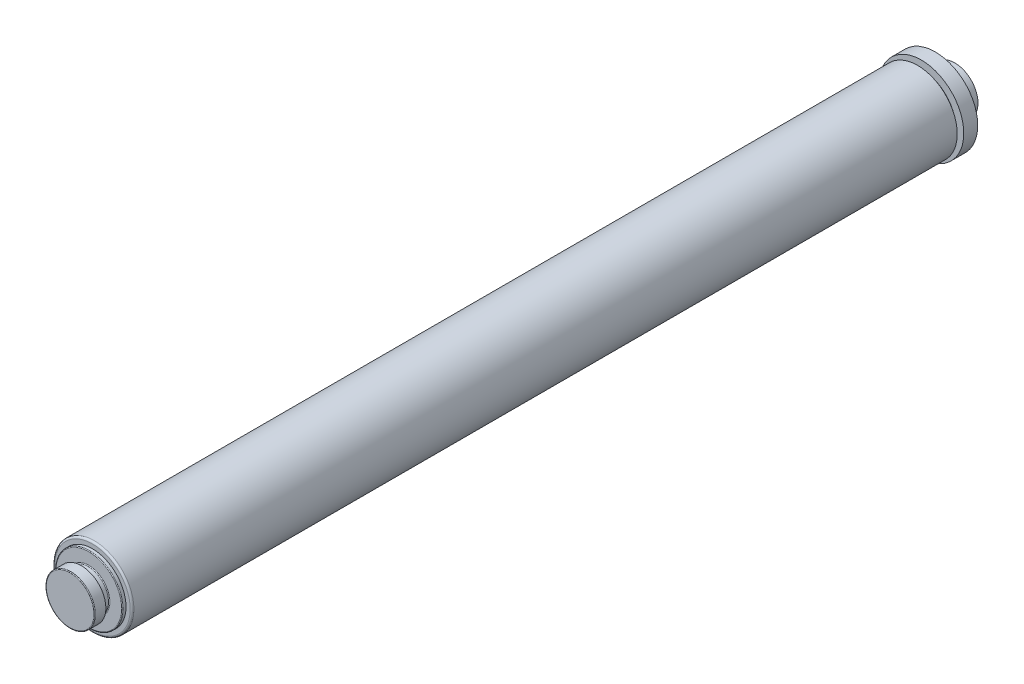
ISO-10303-21;
HEADER;
FILE_DESCRIPTION(('STEP AP214'),'2;1');
FILE_NAME('part.step','',(''),(''),'','','');
FILE_SCHEMA(('AUTOMOTIVE_DESIGN { 1 0 10303 214 1 1 1 1 }'));
ENDSEC;
DATA;
#1=APPLICATION_CONTEXT('core data for automotive mechanical design processes');
#2=APPLICATION_PROTOCOL_DEFINITION('international standard','automotive_design',2000,#1);
#3=PRODUCT_CONTEXT('',#1,'mechanical');
#4=PRODUCT('Part','Part','',(#3));
#5=PRODUCT_RELATED_PRODUCT_CATEGORY('part','',(#4));
#6=PRODUCT_DEFINITION_FORMATION('','',#4);
#7=PRODUCT_DEFINITION_CONTEXT('part definition',#1,'design');
#8=PRODUCT_DEFINITION('design','',#6,#7);
#9=PRODUCT_DEFINITION_SHAPE('','',#8);
#10=(LENGTH_UNIT() NAMED_UNIT(*) SI_UNIT(.MILLI.,.METRE.));
#11=(NAMED_UNIT(*) PLANE_ANGLE_UNIT() SI_UNIT($,.RADIAN.));
#12=(NAMED_UNIT(*) SI_UNIT($,.STERADIAN.) SOLID_ANGLE_UNIT());
#13=UNCERTAINTY_MEASURE_WITH_UNIT(LENGTH_MEASURE(1.E-05),#10,'distance_accuracy_value','');
#14=(GEOMETRIC_REPRESENTATION_CONTEXT(3) GLOBAL_UNCERTAINTY_ASSIGNED_CONTEXT((#13)) GLOBAL_UNIT_ASSIGNED_CONTEXT((#10,
#11,#12)) REPRESENTATION_CONTEXT('',''));
#15=CARTESIAN_POINT('',(0.,0.,0.));
#16=DIRECTION('',(0.,0.,1.));
#17=DIRECTION('',(1.,0.,0.));
#18=AXIS2_PLACEMENT_3D('',#15,#16,#17);
#19=CARTESIAN_POINT('',(0.,0.,562.356));
#20=DIRECTION('',(0.,0.,-1.));
#21=DIRECTION('',(-1.,0.,0.));
#22=AXIS2_PLACEMENT_3D('',#19,#20,#21);
#23=CYLINDRICAL_SURFACE('',#22,26.9875);
#24=CARTESIAN_POINT('',(0.,0.,561.086));
#25=DIRECTION('',(0.,0.,1.));
#26=DIRECTION('',(1.,0.,0.));
#27=AXIS2_PLACEMENT_3D('',#24,#25,#26);
#28=CIRCLE('',#27,26.9875);
#29=CARTESIAN_POINT('',(26.9875,0.,561.086));
#30=VERTEX_POINT('',#29);
#31=EDGE_CURVE('E35',#30,#30,#28,.F.);
#32=ORIENTED_EDGE('',*,*,#31,.T.);
#33=EDGE_LOOP('',(#32));
#34=FACE_BOUND('',#33,.T.);
#35=CARTESIAN_POINT('',(0.,0.,0.));
#36=DIRECTION('',(0.,0.,1.));
#37=DIRECTION('',(1.,0.,0.));
#38=AXIS2_PLACEMENT_3D('',#35,#36,#37);
#39=CIRCLE('',#38,26.9875);
#40=CARTESIAN_POINT('',(26.9875,0.,0.));
#41=VERTEX_POINT('',#40);
#42=EDGE_CURVE('E63',#41,#41,#39,.T.);
#43=ORIENTED_EDGE('',*,*,#42,.T.);
#44=EDGE_LOOP('',(#43));
#45=FACE_BOUND('',#44,.T.);
#46=ADVANCED_FACE('F31',(#34,#45),#23,.T.);
#47=CARTESIAN_POINT('',(0.,0.,562.356));
#48=DIRECTION('',(0.,0.,1.));
#49=DIRECTION('',(1.,0.,0.));
#50=AXIS2_PLACEMENT_3D('',#47,#48,#49);
#51=PLANE('',#50);
#52=CARTESIAN_POINT('',(0.,0.,562.356));
#53=DIRECTION('',(0.,0.,1.));
#54=DIRECTION('',(1.,0.,0.));
#55=AXIS2_PLACEMENT_3D('',#52,#53,#54);
#56=CIRCLE('',#55,25.7175);
#57=CARTESIAN_POINT('',(25.7175,0.,562.356));
#58=VERTEX_POINT('',#57);
#59=EDGE_CURVE('E86',#58,#58,#56,.T.);
#60=ORIENTED_EDGE('',*,*,#59,.T.);
#61=EDGE_LOOP('',(#60));
#62=FACE_BOUND('',#61,.T.);
#63=CARTESIAN_POINT('',(0.,0.,562.356));
#64=DIRECTION('',(0.,0.,1.));
#65=DIRECTION('',(1.,0.,0.));
#66=AXIS2_PLACEMENT_3D('',#63,#64,#65);
#67=CIRCLE('',#66,22.86);
#68=CARTESIAN_POINT('',(22.86,0.,562.356));
#69=VERTEX_POINT('',#68);
#70=EDGE_CURVE('E64',#69,#69,#67,.T.);
#71=ORIENTED_EDGE('',*,*,#70,.F.);
#72=EDGE_LOOP('',(#71));
#73=FACE_BOUND('',#72,.T.);
#74=ADVANCED_FACE('F109',(#62,#73),#51,.T.);
#75=CARTESIAN_POINT('',(0.,0.,0.));
#76=DIRECTION('',(0.,0.,1.));
#77=DIRECTION('',(1.,0.,0.));
#78=AXIS2_PLACEMENT_3D('',#75,#76,#77);
#79=PLANE('',#78);
#80=CARTESIAN_POINT('',(0.,0.,0.));
#81=DIRECTION('',(0.,0.,-1.));
#82=DIRECTION('',(-1.,0.,0.));
#83=AXIS2_PLACEMENT_3D('',#80,#81,#82);
#84=CIRCLE('',#83,23.6278359328573);
#85=CARTESIAN_POINT('',(-23.6278359328573,0.,0.));
#86=VERTEX_POINT('',#85);
#87=EDGE_CURVE('E39',#86,#86,#84,.T.);
#88=ORIENTED_EDGE('',*,*,#87,.F.);
#89=EDGE_LOOP('',(#88));
#90=FACE_BOUND('',#89,.T.);
#91=ORIENTED_EDGE('',*,*,#42,.F.);
#92=EDGE_LOOP('',(#91));
#93=FACE_BOUND('',#92,.T.);
#94=ADVANCED_FACE('F114',(#90,#93),#79,.F.);
#95=CARTESIAN_POINT('',(0.,0.,564.896));
#96=DIRECTION('',(0.,0.,-1.));
#97=DIRECTION('',(-1.,0.,0.));
#98=AXIS2_PLACEMENT_3D('',#95,#96,#97);
#99=CYLINDRICAL_SURFACE('',#98,22.86);
#100=CARTESIAN_POINT('',(0.,0.,564.388));
#101=DIRECTION('',(0.,0.,1.));
#102=DIRECTION('',(1.,0.,0.));
#103=AXIS2_PLACEMENT_3D('',#100,#101,#102);
#104=CIRCLE('',#103,22.86);
#105=CARTESIAN_POINT('',(22.86,0.,564.388));
#106=VERTEX_POINT('',#105);
#107=EDGE_CURVE('E84',#106,#106,#104,.F.);
#108=ORIENTED_EDGE('',*,*,#107,.T.);
#109=EDGE_LOOP('',(#108));
#110=FACE_BOUND('',#109,.T.);
#111=ORIENTED_EDGE('',*,*,#70,.T.);
#112=EDGE_LOOP('',(#111));
#113=FACE_BOUND('',#112,.T.);
#114=ADVANCED_FACE('F156',(#110,#113),#99,.T.);
#115=CARTESIAN_POINT('',(0.,0.,564.896));
#116=DIRECTION('',(0.,0.,1.));
#117=DIRECTION('',(1.,0.,0.));
#118=AXIS2_PLACEMENT_3D('',#115,#116,#117);
#119=PLANE('',#118);
#120=CARTESIAN_POINT('',(0.,0.,564.896));
#121=DIRECTION('',(0.,0.,1.));
#122=DIRECTION('',(1.,0.,0.));
#123=AXIS2_PLACEMENT_3D('',#120,#121,#122);
#124=CIRCLE('',#123,22.352);
#125=CARTESIAN_POINT('',(22.352,0.,564.896));
#126=VERTEX_POINT('',#125);
#127=EDGE_CURVE('E81',#126,#126,#124,.T.);
#128=ORIENTED_EDGE('',*,*,#127,.T.);
#129=EDGE_LOOP('',(#128));
#130=FACE_BOUND('',#129,.T.);
#131=CARTESIAN_POINT('',(0.,0.,564.896));
#132=DIRECTION('',(0.,0.,1.));
#133=DIRECTION('',(1.,0.,0.));
#134=AXIS2_PLACEMENT_3D('',#131,#132,#133);
#135=CIRCLE('',#134,14.4237669709821);
#136=CARTESIAN_POINT('',(14.4237669709821,0.,564.896));
#137=VERTEX_POINT('',#136);
#138=EDGE_CURVE('E78',#137,#137,#135,.F.);
#139=ORIENTED_EDGE('',*,*,#138,.T.);
#140=EDGE_LOOP('',(#139));
#141=FACE_BOUND('',#140,.T.);
#142=ADVANCED_FACE('F135',(#130,#141),#119,.T.);
#143=CARTESIAN_POINT('',(0.,0.,569.976));
#144=DIRECTION('',(0.,0.,-1.));
#145=DIRECTION('',(-1.,0.,0.));
#146=AXIS2_PLACEMENT_3D('',#143,#144,#145);
#147=CYLINDRICAL_SURFACE('',#146,13.9157669709821);
#148=CARTESIAN_POINT('',(0.,0.,565.404));
#149=DIRECTION('',(0.,0.,1.));
#150=DIRECTION('',(1.,0.,0.));
#151=AXIS2_PLACEMENT_3D('',#148,#149,#150);
#152=CIRCLE('',#151,13.9157669709821);
#153=CARTESIAN_POINT('',(13.9157669709821,0.,565.404));
#154=VERTEX_POINT('',#153);
#155=EDGE_CURVE('E75',#154,#154,#152,.T.);
#156=ORIENTED_EDGE('',*,*,#155,.T.);
#157=EDGE_LOOP('',(#156));
#158=FACE_BOUND('',#157,.T.);
#159=CARTESIAN_POINT('',(0.,0.,569.976));
#160=DIRECTION('',(0.,0.,1.));
#161=DIRECTION('',(1.,0.,0.));
#162=AXIS2_PLACEMENT_3D('',#159,#160,#161);
#163=CIRCLE('',#162,13.9157669709821);
#164=CARTESIAN_POINT('',(13.9157669709821,0.,569.976));
#165=VERTEX_POINT('',#164);
#166=EDGE_CURVE('E60',#165,#165,#163,.T.);
#167=ORIENTED_EDGE('',*,*,#166,.F.);
#168=EDGE_LOOP('',(#167));
#169=FACE_BOUND('',#168,.T.);
#170=ADVANCED_FACE('F131',(#158,#169),#147,.T.);
#171=CARTESIAN_POINT('',(0.,0.,577.596));
#172=DIRECTION('',(0.,0.,-1.));
#173=DIRECTION('',(-1.,0.,0.));
#174=AXIS2_PLACEMENT_3D('',#171,#172,#173);
#175=CYLINDRICAL_SURFACE('',#174,16.7317867232158);
#176=CARTESIAN_POINT('',(0.,0.,577.088));
#177=DIRECTION('',(0.,0.,1.));
#178=DIRECTION('',(1.,0.,0.));
#179=AXIS2_PLACEMENT_3D('',#176,#177,#178);
#180=CIRCLE('',#179,16.7317867232158);
#181=CARTESIAN_POINT('',(-16.7317867232158,0.,577.088));
#182=VERTEX_POINT('',#181);
#183=EDGE_CURVE('E72',#182,#182,#180,.F.);
#184=CARTESIAN_POINT('',(0.,0.,569.976));
#185=DIRECTION('',(0.,0.,1.));
#186=DIRECTION('',(1.,0.,0.));
#187=AXIS2_PLACEMENT_3D('',#184,#185,#186);
#188=CIRCLE('',#187,16.7317867232158);
#189=CARTESIAN_POINT('',(-16.7317867232158,0.,569.976));
#190=VERTEX_POINT('',#189);
#191=EDGE_CURVE('E56',#190,#190,#188,.T.);
#192=CARTESIAN_POINT('',(-16.7317867232158,0.,577.088));
#193=CARTESIAN_POINT('',(-16.7317867232158,0.,577.013916666667));
#194=CARTESIAN_POINT('',(-16.7317867232158,0.,576.939833333333));
#195=CARTESIAN_POINT('',(-16.7317867232158,0.,576.791666666667));
#196=CARTESIAN_POINT('',(-16.7317867232158,0.,576.717583333333));
#197=CARTESIAN_POINT('',(-16.7317867232158,0.,576.569416666666));
#198=CARTESIAN_POINT('',(-16.7317867232158,0.,576.495333333333));
#199=CARTESIAN_POINT('',(-16.7317867232158,0.,576.347166666667));
#200=CARTESIAN_POINT('',(-16.7317867232158,0.,576.273083333333));
#201=CARTESIAN_POINT('',(-16.7317867232158,0.,576.124916666667));
#202=CARTESIAN_POINT('',(-16.7317867232158,0.,576.050833333333));
#203=CARTESIAN_POINT('',(-16.7317867232158,0.,575.902666666667));
#204=CARTESIAN_POINT('',(-16.7317867232158,0.,575.828583333333));
#205=CARTESIAN_POINT('',(-16.7317867232158,0.,575.680416666666));
#206=CARTESIAN_POINT('',(-16.7317867232158,0.,575.606333333333));
#207=CARTESIAN_POINT('',(-16.7317867232158,0.,575.458166666666));
#208=CARTESIAN_POINT('',(-16.7317867232158,0.,575.384083333333));
#209=CARTESIAN_POINT('',(-16.7317867232158,0.,575.235916666667));
#210=CARTESIAN_POINT('',(-16.7317867232158,0.,575.161833333333));
#211=CARTESIAN_POINT('',(-16.7317867232158,0.,575.013666666666));
#212=CARTESIAN_POINT('',(-16.7317867232158,0.,574.939583333333));
#213=CARTESIAN_POINT('',(-16.7317867232158,0.,574.791416666667));
#214=CARTESIAN_POINT('',(-16.7317867232158,0.,574.717333333333));
#215=CARTESIAN_POINT('',(-16.7317867232158,0.,574.569166666666));
#216=CARTESIAN_POINT('',(-16.7317867232158,0.,574.495083333333));
#217=CARTESIAN_POINT('',(-16.7317867232158,0.,574.346916666667));
#218=CARTESIAN_POINT('',(-16.7317867232158,0.,574.272833333333));
#219=CARTESIAN_POINT('',(-16.7317867232158,0.,574.124666666666));
#220=CARTESIAN_POINT('',(-16.7317867232158,0.,574.050583333333));
#221=CARTESIAN_POINT('',(-16.7317867232158,0.,573.902416666667));
#222=CARTESIAN_POINT('',(-16.7317867232158,0.,573.828333333333));
#223=CARTESIAN_POINT('',(-16.7317867232158,0.,573.680166666667));
#224=CARTESIAN_POINT('',(-16.7317867232158,0.,573.606083333333));
#225=CARTESIAN_POINT('',(-16.7317867232158,0.,573.457916666667));
#226=CARTESIAN_POINT('',(-16.7317867232158,0.,573.383833333333));
#227=CARTESIAN_POINT('',(-16.7317867232158,0.,573.235666666666));
#228=CARTESIAN_POINT('',(-16.7317867232158,0.,573.161583333333));
#229=CARTESIAN_POINT('',(-16.7317867232158,0.,573.013416666666));
#230=CARTESIAN_POINT('',(-16.7317867232158,0.,572.939333333333));
#231=CARTESIAN_POINT('',(-16.7317867232158,0.,572.791166666667));
#232=CARTESIAN_POINT('',(-16.7317867232158,0.,572.717083333333));
#233=CARTESIAN_POINT('',(-16.7317867232158,0.,572.568916666666));
#234=CARTESIAN_POINT('',(-16.7317867232158,0.,572.494833333333));
#235=CARTESIAN_POINT('',(-16.7317867232158,0.,572.346666666667));
#236=CARTESIAN_POINT('',(-16.7317867232158,0.,572.272583333333));
#237=CARTESIAN_POINT('',(-16.7317867232158,0.,572.124416666666));
#238=CARTESIAN_POINT('',(-16.7317867232158,0.,572.050333333333));
#239=CARTESIAN_POINT('',(-16.7317867232158,0.,571.902166666667));
#240=CARTESIAN_POINT('',(-16.7317867232158,0.,571.828083333333));
#241=CARTESIAN_POINT('',(-16.7317867232158,0.,571.679916666666));
#242=CARTESIAN_POINT('',(-16.7317867232158,0.,571.605833333333));
#243=CARTESIAN_POINT('',(-16.7317867232158,0.,571.457666666667));
#244=CARTESIAN_POINT('',(-16.7317867232158,0.,571.383583333333));
#245=CARTESIAN_POINT('',(-16.7317867232158,0.,571.235416666667));
#246=CARTESIAN_POINT('',(-16.7317867232158,0.,571.161333333333));
#247=CARTESIAN_POINT('',(-16.7317867232158,0.,571.013166666667));
#248=CARTESIAN_POINT('',(-16.7317867232158,0.,570.939083333333));
#249=CARTESIAN_POINT('',(-16.7317867232158,0.,570.790916666666));
#250=CARTESIAN_POINT('',(-16.7317867232158,0.,570.716833333333));
#251=CARTESIAN_POINT('',(-16.7317867232158,0.,570.568666666667));
#252=CARTESIAN_POINT('',(-16.7317867232158,0.,570.494583333333));
#253=CARTESIAN_POINT('',(-16.7317867232158,0.,570.346416666667));
#254=CARTESIAN_POINT('',(-16.7317867232158,0.,570.272333333333));
#255=CARTESIAN_POINT('',(-16.7317867232158,0.,570.124166666666));
#256=CARTESIAN_POINT('',(-16.7317867232158,0.,570.050083333333));
#257=CARTESIAN_POINT('',(-16.7317867232158,0.,569.976));
#258=B_SPLINE_CURVE_WITH_KNOTS('',3,(#192,#193,#194,#195,#196,#197,#198,#199,#200,#201,#202,
#203,#204,#205,#206,#207,#208,#209,#210,#211,#212,#213,#214,#215,#216,#217,#218,#219,#220,#221,
#222,#223,#224,#225,#226,#227,#228,#229,#230,#231,#232,#233,#234,#235,#236,#237,#238,#239,#240,
#241,#242,#243,#244,#245,#246,#247,#248,#249,#250,#251,#252,#253,#254,#255,#256,#257),
.UNSPECIFIED.,.F.,.F.,(4,2,2,2,2,2,2,2,2,2,2,2,2,2,2,2,2,2,2,2,2,2,2,2,2,2,2,2,2,2,2,2,4),(0.,
0.22225000000009,0.44450000000007,0.666750000000049,0.889000000000029,1.11125000000001,
1.3335000000001,1.55575000000008,1.77800000000006,2.00025000000004,2.22250000000002,
2.44475000000011,2.66700000000009,2.88925000000007,3.11150000000004,3.33375000000002,3.556,
3.77825000000009,4.00050000000007,4.22275000000005,4.44500000000003,4.66725000000001,
4.8895000000001,5.11175000000008,5.33400000000006,5.55625000000004,5.77850000000002,
6.00075000000011,6.22300000000009,6.44525000000007,6.66750000000005,6.88975000000003,
7.11200000000001),.UNSPECIFIED.);
#259=EDGE_CURVE('BSEAM134',#182,#190,#258,.T.);
#260=ORIENTED_EDGE('',*,*,#183,.T.);
#261=ORIENTED_EDGE('',*,*,#191,.T.);
#262=ORIENTED_EDGE('',*,*,#259,.T.);
#263=ORIENTED_EDGE('',*,*,#259,.F.);
#264=EDGE_LOOP('',(#260,#262,#261,#263));
#265=FACE_BOUND('',#264,.T.);
#266=ADVANCED_FACE('F134',(#265),#175,.T.);
#267=CARTESIAN_POINT('',(0.,0.,577.596));
#268=DIRECTION('',(0.,0.,1.));
#269=DIRECTION('',(1.,0.,0.));
#270=AXIS2_PLACEMENT_3D('',#267,#268,#269);
#271=PLANE('',#270);
#272=CARTESIAN_POINT('',(0.,0.,577.596));
#273=DIRECTION('',(0.,0.,1.));
#274=DIRECTION('',(1.,0.,0.));
#275=AXIS2_PLACEMENT_3D('',#272,#273,#274);
#276=CIRCLE('',#275,16.2237867232158);
#277=CARTESIAN_POINT('',(16.2237867232158,0.,577.596));
#278=VERTEX_POINT('',#277);
#279=EDGE_CURVE('E67',#278,#278,#276,.T.);
#280=ORIENTED_EDGE('',*,*,#279,.T.);
#281=EDGE_LOOP('',(#280));
#282=FACE_BOUND('',#281,.T.);
#283=ADVANCED_FACE('F141',(#282),#271,.T.);
#284=CARTESIAN_POINT('',(0.,0.,569.976));
#285=DIRECTION('',(0.,0.,1.));
#286=DIRECTION('',(1.,0.,0.));
#287=AXIS2_PLACEMENT_3D('',#284,#285,#286);
#288=PLANE('',#287);
#289=ORIENTED_EDGE('',*,*,#166,.T.);
#290=EDGE_LOOP('',(#289));
#291=FACE_BOUND('',#290,.T.);
#292=ORIENTED_EDGE('',*,*,#191,.F.);
#293=EDGE_LOOP('',(#292));
#294=FACE_BOUND('',#293,.T.);
#295=ADVANCED_FACE('F121',(#291,#294),#288,.F.);
#296=CARTESIAN_POINT('',(0.,0.,577.088));
#297=DIRECTION('',(0.,0.,1.));
#298=DIRECTION('',(1.,0.,0.));
#299=AXIS2_PLACEMENT_3D('',#296,#297,#298);
#300=TOROIDAL_SURFACE('',#299,16.2237867232158,0.508);
#301=ORIENTED_EDGE('',*,*,#183,.F.);
#302=EDGE_LOOP('',(#301));
#303=FACE_BOUND('',#302,.T.);
#304=ORIENTED_EDGE('',*,*,#279,.F.);
#305=EDGE_LOOP('',(#304));
#306=FACE_BOUND('',#305,.T.);
#307=ADVANCED_FACE('F118',(#303,#306),#300,.T.);
#308=CARTESIAN_POINT('',(0.,0.,565.404));
#309=DIRECTION('',(0.,0.,1.));
#310=DIRECTION('',(1.,0.,0.));
#311=AXIS2_PLACEMENT_3D('',#308,#309,#310);
#312=TOROIDAL_SURFACE('',#311,14.4237669709821,0.508);
#313=ORIENTED_EDGE('',*,*,#138,.F.);
#314=EDGE_LOOP('',(#313));
#315=FACE_BOUND('',#314,.T.);
#316=ORIENTED_EDGE('',*,*,#155,.F.);
#317=EDGE_LOOP('',(#316));
#318=FACE_BOUND('',#317,.T.);
#319=ADVANCED_FACE('F106',(#315,#318),#312,.F.);
#320=CARTESIAN_POINT('',(0.,0.,564.388));
#321=DIRECTION('',(0.,0.,1.));
#322=DIRECTION('',(1.,0.,0.));
#323=AXIS2_PLACEMENT_3D('',#320,#321,#322);
#324=TOROIDAL_SURFACE('',#323,22.352,0.508);
#325=ORIENTED_EDGE('',*,*,#107,.F.);
#326=EDGE_LOOP('',(#325));
#327=FACE_BOUND('',#326,.T.);
#328=ORIENTED_EDGE('',*,*,#127,.F.);
#329=EDGE_LOOP('',(#328));
#330=FACE_BOUND('',#329,.T.);
#331=ADVANCED_FACE('F98',(#327,#330),#324,.T.);
#332=CARTESIAN_POINT('',(0.,0.,561.086));
#333=DIRECTION('',(0.,0.,1.));
#334=DIRECTION('',(1.,0.,0.));
#335=AXIS2_PLACEMENT_3D('',#332,#333,#334);
#336=TOROIDAL_SURFACE('',#335,25.7175,1.27);
#337=ORIENTED_EDGE('',*,*,#31,.F.);
#338=EDGE_LOOP('',(#337));
#339=FACE_BOUND('',#338,.T.);
#340=ORIENTED_EDGE('',*,*,#59,.F.);
#341=EDGE_LOOP('',(#340));
#342=FACE_BOUND('',#341,.T.);
#343=ADVANCED_FACE('F33',(#339,#342),#336,.T.);
#344=CARTESIAN_POINT('',(0.,0.,-2.54));
#345=DIRECTION('',(0.,0.,1.));
#346=DIRECTION('',(1.,0.,0.));
#347=AXIS2_PLACEMENT_3D('',#344,#345,#346);
#348=CYLINDRICAL_SURFACE('',#347,23.6278359328573);
#349=CARTESIAN_POINT('',(0.,0.,-2.54));
#350=DIRECTION('',(0.,0.,-1.));
#351=DIRECTION('',(-1.,0.,0.));
#352=AXIS2_PLACEMENT_3D('',#349,#350,#351);
#353=CIRCLE('',#352,23.6278359328573);
#354=CARTESIAN_POINT('',(-23.6278359328573,0.,-2.54));
#355=VERTEX_POINT('',#354);
#356=EDGE_CURVE('E51',#355,#355,#353,.T.);
#357=ORIENTED_EDGE('',*,*,#356,.F.);
#358=EDGE_LOOP('',(#357));
#359=FACE_BOUND('',#358,.T.);
#360=ORIENTED_EDGE('',*,*,#87,.T.);
#361=EDGE_LOOP('',(#360));
#362=FACE_BOUND('',#361,.T.);
#363=ADVANCED_FACE('F97',(#359,#362),#348,.T.);
#364=CARTESIAN_POINT('',(0.,0.,-12.065));
#365=DIRECTION('',(0.,0.,1.));
#366=DIRECTION('',(1.,0.,0.));
#367=AXIS2_PLACEMENT_3D('',#364,#365,#366);
#368=CYLINDRICAL_SURFACE('',#367,28.8925);
#369=CARTESIAN_POINT('',(0.,0.,-12.065));
#370=DIRECTION('',(0.,0.,-1.));
#371=DIRECTION('',(-1.,0.,0.));
#372=AXIS2_PLACEMENT_3D('',#369,#370,#371);
#373=CIRCLE('',#372,28.8925);
#374=CARTESIAN_POINT('',(28.8925,0.,-12.065));
#375=VERTEX_POINT('',#374);
#376=EDGE_CURVE('E48',#375,#375,#373,.T.);
#377=CARTESIAN_POINT('',(0.,0.,-2.54));
#378=DIRECTION('',(0.,0.,-1.));
#379=DIRECTION('',(-1.,0.,0.));
#380=AXIS2_PLACEMENT_3D('',#377,#378,#379);
#381=CIRCLE('',#380,28.8925);
#382=CARTESIAN_POINT('',(28.8925,0.,-2.54));
#383=VERTEX_POINT('',#382);
#384=EDGE_CURVE('E52',#383,#383,#381,.T.);
#385=CARTESIAN_POINT('',(28.8925,0.,-12.065));
#386=CARTESIAN_POINT('',(28.8925,0.,-11.96578125));
#387=CARTESIAN_POINT('',(28.8925,0.,-11.8665625));
#388=CARTESIAN_POINT('',(28.8925,0.,-11.668125));
#389=CARTESIAN_POINT('',(28.8925,0.,-11.56890625));
#390=CARTESIAN_POINT('',(28.8925,0.,-11.37046875));
#391=CARTESIAN_POINT('',(28.8925,0.,-11.27125));
#392=CARTESIAN_POINT('',(28.8925,0.,-11.0728125));
#393=CARTESIAN_POINT('',(28.8925,0.,-10.97359375));
#394=CARTESIAN_POINT('',(28.8925,0.,-10.77515625));
#395=CARTESIAN_POINT('',(28.8925,0.,-10.6759375));
#396=CARTESIAN_POINT('',(28.8925,0.,-10.4775));
#397=CARTESIAN_POINT('',(28.8925,0.,-10.37828125));
#398=CARTESIAN_POINT('',(28.8925,0.,-10.17984375));
#399=CARTESIAN_POINT('',(28.8925,0.,-10.080625));
#400=CARTESIAN_POINT('',(28.8925,0.,-9.8821875));
#401=CARTESIAN_POINT('',(28.8925,0.,-9.78296875));
#402=CARTESIAN_POINT('',(28.8925,0.,-9.58453125));
#403=CARTESIAN_POINT('',(28.8925,0.,-9.4853125));
#404=CARTESIAN_POINT('',(28.8925,0.,-9.286875));
#405=CARTESIAN_POINT('',(28.8925,0.,-9.18765625));
#406=CARTESIAN_POINT('',(28.8925,0.,-8.98921875));
#407=CARTESIAN_POINT('',(28.8925,0.,-8.89));
#408=CARTESIAN_POINT('',(28.8925,0.,-8.6915625));
#409=CARTESIAN_POINT('',(28.8925,0.,-8.59234375));
#410=CARTESIAN_POINT('',(28.8925,0.,-8.39390625));
#411=CARTESIAN_POINT('',(28.8925,0.,-8.2946875));
#412=CARTESIAN_POINT('',(28.8925,0.,-8.09625));
#413=CARTESIAN_POINT('',(28.8925,0.,-7.99703125));
#414=CARTESIAN_POINT('',(28.8925,0.,-7.79859375));
#415=CARTESIAN_POINT('',(28.8925,0.,-7.699375));
#416=CARTESIAN_POINT('',(28.8925,0.,-7.5009375));
#417=CARTESIAN_POINT('',(28.8925,0.,-7.40171875));
#418=CARTESIAN_POINT('',(28.8925,0.,-7.20328125));
#419=CARTESIAN_POINT('',(28.8925,0.,-7.1040625));
#420=CARTESIAN_POINT('',(28.8925,0.,-6.905625));
#421=CARTESIAN_POINT('',(28.8925,0.,-6.80640625));
#422=CARTESIAN_POINT('',(28.8925,0.,-6.60796875));
#423=CARTESIAN_POINT('',(28.8925,0.,-6.50875));
#424=CARTESIAN_POINT('',(28.8925,0.,-6.3103125));
#425=CARTESIAN_POINT('',(28.8925,0.,-6.21109375));
#426=CARTESIAN_POINT('',(28.8925,0.,-6.01265625));
#427=CARTESIAN_POINT('',(28.8925,0.,-5.9134375));
#428=CARTESIAN_POINT('',(28.8925,0.,-5.715));
#429=CARTESIAN_POINT('',(28.8925,0.,-5.61578125));
#430=CARTESIAN_POINT('',(28.8925,0.,-5.41734375));
#431=CARTESIAN_POINT('',(28.8925,0.,-5.318125));
#432=CARTESIAN_POINT('',(28.8925,0.,-5.1196875));
#433=CARTESIAN_POINT('',(28.8925,0.,-5.02046875));
#434=CARTESIAN_POINT('',(28.8925,0.,-4.82203125));
#435=CARTESIAN_POINT('',(28.8925,0.,-4.7228125));
#436=CARTESIAN_POINT('',(28.8925,0.,-4.524375));
#437=CARTESIAN_POINT('',(28.8925,0.,-4.42515625));
#438=CARTESIAN_POINT('',(28.8925,0.,-4.22671875));
#439=CARTESIAN_POINT('',(28.8925,0.,-4.1275));
#440=CARTESIAN_POINT('',(28.8925,0.,-3.9290625));
#441=CARTESIAN_POINT('',(28.8925,0.,-3.82984375));
#442=CARTESIAN_POINT('',(28.8925,0.,-3.63140625));
#443=CARTESIAN_POINT('',(28.8925,0.,-3.5321875));
#444=CARTESIAN_POINT('',(28.8925,0.,-3.33375));
#445=CARTESIAN_POINT('',(28.8925,0.,-3.23453125));
#446=CARTESIAN_POINT('',(28.8925,0.,-3.03609375));
#447=CARTESIAN_POINT('',(28.8925,0.,-2.936875));
#448=CARTESIAN_POINT('',(28.8925,0.,-2.7384375));
#449=CARTESIAN_POINT('',(28.8925,0.,-2.63921875));
#450=CARTESIAN_POINT('',(28.8925,0.,-2.54));
#451=B_SPLINE_CURVE_WITH_KNOTS('',3,(#385,#386,#387,#388,#389,#390,#391,#392,#393,#394,#395,
#396,#397,#398,#399,#400,#401,#402,#403,#404,#405,#406,#407,#408,#409,#410,#411,#412,#413,#414,
#415,#416,#417,#418,#419,#420,#421,#422,#423,#424,#425,#426,#427,#428,#429,#430,#431,#432,#433,
#434,#435,#436,#437,#438,#439,#440,#441,#442,#443,#444,#445,#446,#447,#448,#449,#450),
.UNSPECIFIED.,.F.,.F.,(4,2,2,2,2,2,2,2,2,2,2,2,2,2,2,2,2,2,2,2,2,2,2,2,2,2,2,2,2,2,2,2,4),(0.,
0.29765625,0.5953125,0.892968750000001,1.190625,1.48828125,1.7859375,2.08359375,2.38125,
2.67890625,2.9765625,3.27421875,3.571875,3.86953125,4.1671875,4.46484375,4.7625,5.06015625,
5.3578125,5.65546875,5.953125,6.25078125,6.5484375,6.84609375,7.14375,7.44140625,7.7390625,
8.03671875,8.334375,8.63203125,8.9296875,9.22734375,9.525),.UNSPECIFIED.);
#452=EDGE_CURVE('BSEAM103',#375,#383,#451,.T.);
#453=ORIENTED_EDGE('',*,*,#376,.F.);
#454=ORIENTED_EDGE('',*,*,#384,.T.);
#455=ORIENTED_EDGE('',*,*,#452,.T.);
#456=ORIENTED_EDGE('',*,*,#452,.F.);
#457=EDGE_LOOP('',(#453,#455,#454,#456));
#458=FACE_BOUND('',#457,.T.);
#459=ADVANCED_FACE('F103',(#458),#368,.T.);
#460=CARTESIAN_POINT('',(0.,0.,-12.065));
#461=DIRECTION('',(0.,0.,-1.));
#462=DIRECTION('',(-1.,0.,0.));
#463=AXIS2_PLACEMENT_3D('',#460,#461,#462);
#464=PLANE('',#463);
#465=CARTESIAN_POINT('',(0.,0.,-12.065));
#466=DIRECTION('',(0.,0.,-1.));
#467=DIRECTION('',(-1.,0.,0.));
#468=AXIS2_PLACEMENT_3D('',#465,#466,#467);
#469=CIRCLE('',#468,15.875);
#470=CARTESIAN_POINT('',(15.875,0.,-12.065));
#471=VERTEX_POINT('',#470);
#472=EDGE_CURVE('E10',#471,#471,#469,.T.);
#473=ORIENTED_EDGE('',*,*,#472,.F.);
#474=EDGE_LOOP('',(#473));
#475=FACE_BOUND('',#474,.T.);
#476=ORIENTED_EDGE('',*,*,#376,.T.);
#477=EDGE_LOOP('',(#476));
#478=FACE_BOUND('',#477,.T.);
#479=ADVANCED_FACE('F207',(#475,#478),#464,.T.);
#480=CARTESIAN_POINT('',(0.,0.,-2.54));
#481=DIRECTION('',(0.,0.,-1.));
#482=DIRECTION('',(-1.,0.,0.));
#483=AXIS2_PLACEMENT_3D('',#480,#481,#482);
#484=PLANE('',#483);
#485=ORIENTED_EDGE('',*,*,#356,.T.);
#486=EDGE_LOOP('',(#485));
#487=FACE_BOUND('',#486,.T.);
#488=ORIENTED_EDGE('',*,*,#384,.F.);
#489=EDGE_LOOP('',(#488));
#490=FACE_BOUND('',#489,.T.);
#491=ADVANCED_FACE('F217',(#487,#490),#484,.F.);
#492=CARTESIAN_POINT('',(0.,0.,-25.273));
#493=DIRECTION('',(0.,0.,1.));
#494=DIRECTION('',(1.,0.,0.));
#495=AXIS2_PLACEMENT_3D('',#492,#493,#494);
#496=CYLINDRICAL_SURFACE('',#495,15.875);
#497=CARTESIAN_POINT('',(0.,0.,-25.273));
#498=DIRECTION('',(0.,0.,-1.));
#499=DIRECTION('',(-1.,0.,0.));
#500=AXIS2_PLACEMENT_3D('',#497,#498,#499);
#501=CIRCLE('',#500,15.875);
#502=CARTESIAN_POINT('',(15.875,0.,-25.273));
#503=VERTEX_POINT('',#502);
#504=EDGE_CURVE('E47',#503,#503,#501,.T.);
#505=CARTESIAN_POINT('',(15.875,0.,-25.273));
#506=CARTESIAN_POINT('',(15.875,0.,-25.1354166666667));
#507=CARTESIAN_POINT('',(15.875,0.,-24.9978333333333));
#508=CARTESIAN_POINT('',(15.875,0.,-24.7226666666667));
#509=CARTESIAN_POINT('',(15.875,0.,-24.5850833333333));
#510=CARTESIAN_POINT('',(15.875,0.,-24.3099166666667));
#511=CARTESIAN_POINT('',(15.875,0.,-24.1723333333333));
#512=CARTESIAN_POINT('',(15.875,0.,-23.8971666666667));
#513=CARTESIAN_POINT('',(15.875,0.,-23.7595833333333));
#514=CARTESIAN_POINT('',(15.875,0.,-23.4844166666667));
#515=CARTESIAN_POINT('',(15.875,0.,-23.3468333333333));
#516=CARTESIAN_POINT('',(15.875,0.,-23.0716666666667));
#517=CARTESIAN_POINT('',(15.875,0.,-22.9340833333333));
#518=CARTESIAN_POINT('',(15.875,0.,-22.6589166666667));
#519=CARTESIAN_POINT('',(15.875,0.,-22.5213333333333));
#520=CARTESIAN_POINT('',(15.875,0.,-22.2461666666667));
#521=CARTESIAN_POINT('',(15.875,0.,-22.1085833333333));
#522=CARTESIAN_POINT('',(15.875,0.,-21.8334166666667));
#523=CARTESIAN_POINT('',(15.875,0.,-21.6958333333333));
#524=CARTESIAN_POINT('',(15.875,0.,-21.4206666666667));
#525=CARTESIAN_POINT('',(15.875,0.,-21.2830833333333));
#526=CARTESIAN_POINT('',(15.875,0.,-21.0079166666667));
#527=CARTESIAN_POINT('',(15.875,0.,-20.8703333333333));
#528=CARTESIAN_POINT('',(15.875,0.,-20.5951666666667));
#529=CARTESIAN_POINT('',(15.875,0.,-20.4575833333333));
#530=CARTESIAN_POINT('',(15.875,0.,-20.1824166666667));
#531=CARTESIAN_POINT('',(15.875,0.,-20.0448333333333));
#532=CARTESIAN_POINT('',(15.875,0.,-19.7696666666667));
#533=CARTESIAN_POINT('',(15.875,0.,-19.6320833333333));
#534=CARTESIAN_POINT('',(15.875,0.,-19.3569166666667));
#535=CARTESIAN_POINT('',(15.875,0.,-19.2193333333333));
#536=CARTESIAN_POINT('',(15.875,0.,-18.9441666666667));
#537=CARTESIAN_POINT('',(15.875,0.,-18.8065833333333));
#538=CARTESIAN_POINT('',(15.875,0.,-18.5314166666667));
#539=CARTESIAN_POINT('',(15.875,0.,-18.3938333333333));
#540=CARTESIAN_POINT('',(15.875,0.,-18.1186666666667));
#541=CARTESIAN_POINT('',(15.875,0.,-17.9810833333333));
#542=CARTESIAN_POINT('',(15.875,0.,-17.7059166666667));
#543=CARTESIAN_POINT('',(15.875,0.,-17.5683333333333));
#544=CARTESIAN_POINT('',(15.875,0.,-17.2931666666667));
#545=CARTESIAN_POINT('',(15.875,0.,-17.1555833333333));
#546=CARTESIAN_POINT('',(15.875,0.,-16.8804166666667));
#547=CARTESIAN_POINT('',(15.875,0.,-16.7428333333333));
#548=CARTESIAN_POINT('',(15.875,0.,-16.4676666666667));
#549=CARTESIAN_POINT('',(15.875,0.,-16.3300833333333));
#550=CARTESIAN_POINT('',(15.875,0.,-16.0549166666667));
#551=CARTESIAN_POINT('',(15.875,0.,-15.9173333333333));
#552=CARTESIAN_POINT('',(15.875,0.,-15.6421666666667));
#553=CARTESIAN_POINT('',(15.875,0.,-15.5045833333333));
#554=CARTESIAN_POINT('',(15.875,0.,-15.2294166666667));
#555=CARTESIAN_POINT('',(15.875,0.,-15.0918333333333));
#556=CARTESIAN_POINT('',(15.875,0.,-14.8166666666667));
#557=CARTESIAN_POINT('',(15.875,0.,-14.6790833333333));
#558=CARTESIAN_POINT('',(15.875,0.,-14.4039166666667));
#559=CARTESIAN_POINT('',(15.875,0.,-14.2663333333333));
#560=CARTESIAN_POINT('',(15.875,0.,-13.9911666666667));
#561=CARTESIAN_POINT('',(15.875,0.,-13.8535833333333));
#562=CARTESIAN_POINT('',(15.875,0.,-13.5784166666667));
#563=CARTESIAN_POINT('',(15.875,0.,-13.4408333333333));
#564=CARTESIAN_POINT('',(15.875,0.,-13.1656666666667));
#565=CARTESIAN_POINT('',(15.875,0.,-13.0280833333333));
#566=CARTESIAN_POINT('',(15.875,0.,-12.7529166666667));
#567=CARTESIAN_POINT('',(15.875,0.,-12.6153333333333));
#568=CARTESIAN_POINT('',(15.875,0.,-12.3401666666667));
#569=CARTESIAN_POINT('',(15.875,0.,-12.2025833333333));
#570=CARTESIAN_POINT('',(15.875,0.,-12.065));
#571=B_SPLINE_CURVE_WITH_KNOTS('',3,(#505,#506,#507,#508,#509,#510,#511,#512,#513,#514,#515,
#516,#517,#518,#519,#520,#521,#522,#523,#524,#525,#526,#527,#528,#529,#530,#531,#532,#533,#534,
#535,#536,#537,#538,#539,#540,#541,#542,#543,#544,#545,#546,#547,#548,#549,#550,#551,#552,#553,
#554,#555,#556,#557,#558,#559,#560,#561,#562,#563,#564,#565,#566,#567,#568,#569,#570),
.UNSPECIFIED.,.F.,.F.,(4,2,2,2,2,2,2,2,2,2,2,2,2,2,2,2,2,2,2,2,2,2,2,2,2,2,2,2,2,2,2,2,4),(0.,
0.41275,0.825500000000003,1.23825,1.651,2.06375,2.4765,2.88925,3.302,3.71475,4.1275,4.54025,
4.953,5.36575,5.7785,6.19125,6.604,7.01675,7.4295,7.84225,8.255,8.66775,9.0805,9.49325,9.906,
10.31875,10.7315,11.14425,11.557,11.96975,12.3825,12.79525,13.208),.UNSPECIFIED.);
#572=EDGE_CURVE('BSEAM226',#503,#471,#571,.T.);
#573=ORIENTED_EDGE('',*,*,#504,.F.);
#574=ORIENTED_EDGE('',*,*,#472,.T.);
#575=ORIENTED_EDGE('',*,*,#572,.T.);
#576=ORIENTED_EDGE('',*,*,#572,.F.);
#577=EDGE_LOOP('',(#573,#575,#574,#576));
#578=FACE_BOUND('',#577,.T.);
#579=ADVANCED_FACE('F226',(#578),#496,.T.);
#580=CARTESIAN_POINT('',(0.,0.,-25.273));
#581=DIRECTION('',(0.,0.,-1.));
#582=DIRECTION('',(-1.,0.,0.));
#583=AXIS2_PLACEMENT_3D('',#580,#581,#582);
#584=PLANE('',#583);
#585=ORIENTED_EDGE('',*,*,#504,.T.);
#586=EDGE_LOOP('',(#585));
#587=FACE_BOUND('',#586,.T.);
#588=ADVANCED_FACE('F234',(#587),#584,.T.);
#589=CLOSED_SHELL('',(#46,#74,#94,#114,#142,#170,#266,#283,#295,#307,#319,#331,#343,#363,#459,
#479,#491,#579,#588));
#590=MANIFOLD_SOLID_BREP('B2',#589);
#591=ADVANCED_BREP_SHAPE_REPRESENTATION('',(#18,#590),#14);
#592=SHAPE_DEFINITION_REPRESENTATION(#9,#591);
ENDSEC;
END-ISO-10303-21;
